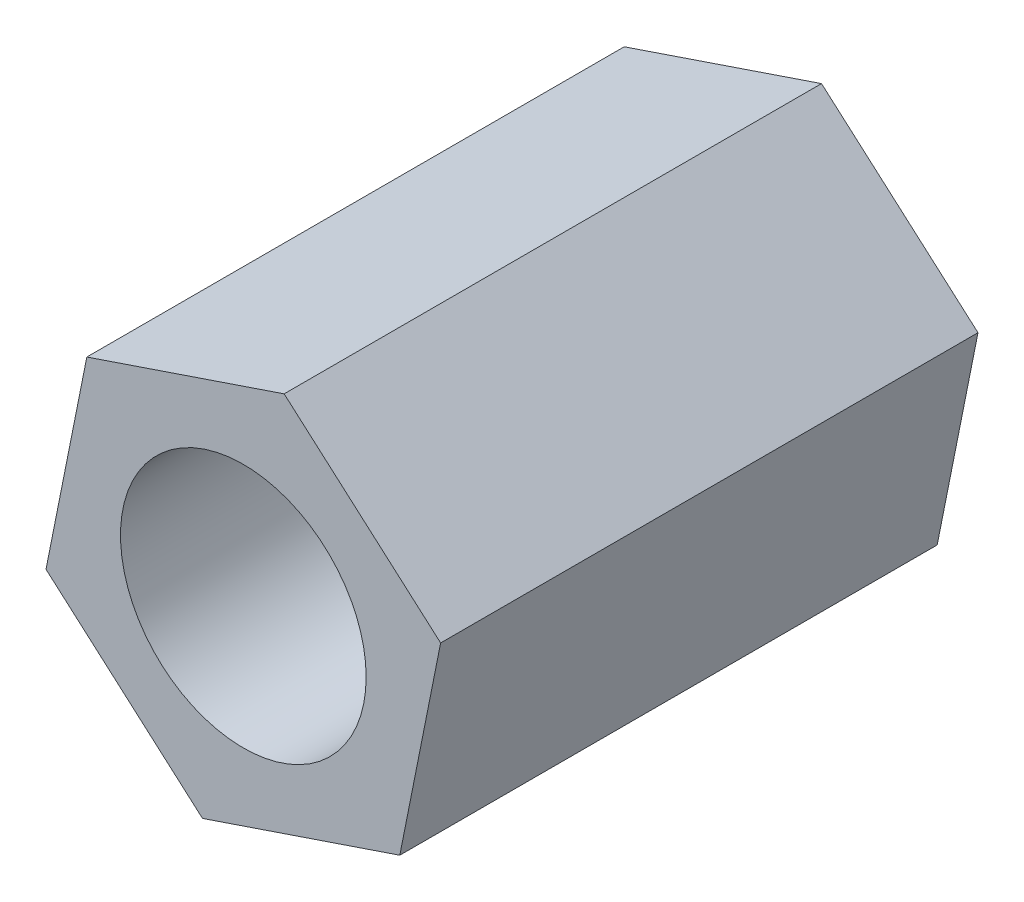
ISO-10303-21;
HEADER;
FILE_DESCRIPTION(('STEP AP214'),'2;1');
FILE_NAME('part.step','',(''),(''),'','','');
FILE_SCHEMA(('AUTOMOTIVE_DESIGN { 1 0 10303 214 1 1 1 1 }'));
ENDSEC;
DATA;
#1=APPLICATION_CONTEXT('core data for automotive mechanical design processes');
#2=APPLICATION_PROTOCOL_DEFINITION('international standard','automotive_design',2000,#1);
#3=PRODUCT_CONTEXT('',#1,'mechanical');
#4=PRODUCT('Part','Part','',(#3));
#5=PRODUCT_RELATED_PRODUCT_CATEGORY('part','',(#4));
#6=PRODUCT_DEFINITION_FORMATION('','',#4);
#7=PRODUCT_DEFINITION_CONTEXT('part definition',#1,'design');
#8=PRODUCT_DEFINITION('design','',#6,#7);
#9=PRODUCT_DEFINITION_SHAPE('','',#8);
#10=(LENGTH_UNIT() NAMED_UNIT(*) SI_UNIT(.MILLI.,.METRE.));
#11=(NAMED_UNIT(*) PLANE_ANGLE_UNIT() SI_UNIT($,.RADIAN.));
#12=(NAMED_UNIT(*) SI_UNIT($,.STERADIAN.) SOLID_ANGLE_UNIT());
#13=UNCERTAINTY_MEASURE_WITH_UNIT(LENGTH_MEASURE(1.E-05),#10,'distance_accuracy_value','');
#14=(GEOMETRIC_REPRESENTATION_CONTEXT(3) GLOBAL_UNCERTAINTY_ASSIGNED_CONTEXT((#13)) GLOBAL_UNIT_ASSIGNED_CONTEXT((#10,
#11,#12)) REPRESENTATION_CONTEXT('',''));
#15=CARTESIAN_POINT('',(0.,0.,0.));
#16=DIRECTION('',(0.,0.,1.));
#17=DIRECTION('',(1.,0.,0.));
#18=AXIS2_PLACEMENT_3D('',#15,#16,#17);
#19=CARTESIAN_POINT('',(0.,0.,7.));
#20=DIRECTION('',(0.,0.,1.));
#21=DIRECTION('',(1.,0.,0.));
#22=AXIS2_PLACEMENT_3D('',#19,#20,#21);
#23=PLANE('',#22);
#24=DIRECTION('',(0.947235538078911,0.320538352464033,0.));
#25=VECTOR('',#24,1.);
#26=CARTESIAN_POINT('',(-0.531918600014743,-2.6609013390751,7.));
#27=LINE('',#26,#25);
#28=CARTESIAN_POINT('',(-0.531918600014743,-2.6609013390751,7.));
#29=VERTEX_POINT('',#28);
#30=CARTESIAN_POINT('',(2.0384488565957,-1.79110568989578,7.));
#31=VERTEX_POINT('',#30);
#32=EDGE_CURVE('E152',#29,#31,#27,.T.);
#33=ORIENTED_EDGE('',*,*,#32,.T.);
#34=DIRECTION('',(0.196023412918392,0.980599215575775,0.));
#35=VECTOR('',#34,1.);
#36=CARTESIAN_POINT('',(2.0384488565957,-1.79110568989578,7.));
#37=LINE('',#36,#35);
#38=CARTESIAN_POINT('',(2.57036745661044,0.869795649179331,7.));
#39=VERTEX_POINT('',#38);
#40=EDGE_CURVE('E100',#31,#39,#37,.T.);
#41=ORIENTED_EDGE('',*,*,#40,.T.);
#42=DIRECTION('',(-0.751212125160518,0.660060863111742,0.));
#43=VECTOR('',#42,1.);
#44=CARTESIAN_POINT('',(2.57036745661044,0.869795649179331,7.));
#45=LINE('',#44,#43);
#46=CARTESIAN_POINT('',(0.531918600014744,2.66090133907511,7.));
#47=VERTEX_POINT('',#46);
#48=EDGE_CURVE('E113',#39,#47,#45,.T.);
#49=ORIENTED_EDGE('',*,*,#48,.T.);
#50=DIRECTION('',(-0.947235538078911,-0.320538352464033,0.));
#51=VECTOR('',#50,1.);
#52=CARTESIAN_POINT('',(0.531918600014744,2.66090133907511,7.));
#53=LINE('',#52,#51);
#54=CARTESIAN_POINT('',(-2.0384488565957,1.79110568989578,7.));
#55=VERTEX_POINT('',#54);
#56=EDGE_CURVE('E107',#47,#55,#53,.T.);
#57=ORIENTED_EDGE('',*,*,#56,.T.);
#58=DIRECTION('',(-0.196023412918393,-0.980599215575775,0.));
#59=VECTOR('',#58,1.);
#60=CARTESIAN_POINT('',(-2.0384488565957,1.79110568989578,7.));
#61=LINE('',#60,#59);
#62=CARTESIAN_POINT('',(-2.57036745661044,-0.869795649179329,7.));
#63=VERTEX_POINT('',#62);
#64=EDGE_CURVE('E111',#55,#63,#61,.T.);
#65=ORIENTED_EDGE('',*,*,#64,.T.);
#66=DIRECTION('',(0.751212125160518,-0.660060863111742,0.));
#67=VECTOR('',#66,1.);
#68=CARTESIAN_POINT('',(-2.57036745661044,-0.869795649179329,7.));
#69=LINE('',#68,#67);
#70=EDGE_CURVE('E63',#63,#29,#69,.T.);
#71=ORIENTED_EDGE('',*,*,#70,.T.);
#72=EDGE_LOOP('',(#33,#41,#49,#57,#65,#71));
#73=FACE_BOUND('',#72,.T.);
#74=CARTESIAN_POINT('',(0.,0.,7.));
#75=DIRECTION('',(0.,0.,1.));
#76=DIRECTION('',(1.,0.,0.));
#77=AXIS2_PLACEMENT_3D('',#74,#75,#76);
#78=CIRCLE('',#77,1.6);
#79=CARTESIAN_POINT('',(1.6,0.,7.));
#80=VERTEX_POINT('',#79);
#81=EDGE_CURVE('E140',#80,#80,#78,.T.);
#82=ORIENTED_EDGE('',*,*,#81,.F.);
#83=EDGE_LOOP('',(#82));
#84=FACE_BOUND('',#83,.T.);
#85=ADVANCED_FACE('F45',(#73,#84),#23,.T.);
#86=CARTESIAN_POINT('',(0.,0.,0.));
#87=DIRECTION('',(0.,0.,1.));
#88=DIRECTION('',(1.,0.,0.));
#89=AXIS2_PLACEMENT_3D('',#86,#87,#88);
#90=PLANE('',#89);
#91=DIRECTION('',(0.947235538078911,0.320538352464033,0.));
#92=VECTOR('',#91,1.);
#93=CARTESIAN_POINT('',(-0.531918600014743,-2.6609013390751,0.));
#94=LINE('',#93,#92);
#95=CARTESIAN_POINT('',(-0.531918600014743,-2.6609013390751,0.));
#96=VERTEX_POINT('',#95);
#97=CARTESIAN_POINT('',(2.0384488565957,-1.79110568989578,0.));
#98=VERTEX_POINT('',#97);
#99=EDGE_CURVE('E135',#96,#98,#94,.T.);
#100=ORIENTED_EDGE('',*,*,#99,.F.);
#101=DIRECTION('',(0.751212125160518,-0.660060863111742,0.));
#102=VECTOR('',#101,1.);
#103=CARTESIAN_POINT('',(-2.57036745661044,-0.869795649179329,0.));
#104=LINE('',#103,#102);
#105=CARTESIAN_POINT('',(-2.57036745661044,-0.869795649179329,0.));
#106=VERTEX_POINT('',#105);
#107=EDGE_CURVE('E92',#106,#96,#104,.T.);
#108=ORIENTED_EDGE('',*,*,#107,.F.);
#109=DIRECTION('',(-0.196023412918393,-0.980599215575775,0.));
#110=VECTOR('',#109,1.);
#111=CARTESIAN_POINT('',(-2.0384488565957,1.79110568989578,0.));
#112=LINE('',#111,#110);
#113=CARTESIAN_POINT('',(-2.0384488565957,1.79110568989578,0.));
#114=VERTEX_POINT('',#113);
#115=EDGE_CURVE('E86',#114,#106,#112,.T.);
#116=ORIENTED_EDGE('',*,*,#115,.F.);
#117=DIRECTION('',(-0.947235538078911,-0.320538352464033,0.));
#118=VECTOR('',#117,1.);
#119=CARTESIAN_POINT('',(0.531918600014744,2.66090133907511,0.));
#120=LINE('',#119,#118);
#121=CARTESIAN_POINT('',(0.531918600014744,2.66090133907511,0.));
#122=VERTEX_POINT('',#121);
#123=EDGE_CURVE('E122',#122,#114,#120,.T.);
#124=ORIENTED_EDGE('',*,*,#123,.F.);
#125=DIRECTION('',(-0.751212125160518,0.660060863111742,0.));
#126=VECTOR('',#125,1.);
#127=CARTESIAN_POINT('',(2.57036745661044,0.869795649179331,0.));
#128=LINE('',#127,#126);
#129=CARTESIAN_POINT('',(2.57036745661044,0.869795649179331,0.));
#130=VERTEX_POINT('',#129);
#131=EDGE_CURVE('E143',#130,#122,#128,.T.);
#132=ORIENTED_EDGE('',*,*,#131,.F.);
#133=DIRECTION('',(0.196023412918392,0.980599215575775,0.));
#134=VECTOR('',#133,1.);
#135=CARTESIAN_POINT('',(2.0384488565957,-1.79110568989578,0.));
#136=LINE('',#135,#134);
#137=EDGE_CURVE('E139',#98,#130,#136,.T.);
#138=ORIENTED_EDGE('',*,*,#137,.F.);
#139=EDGE_LOOP('',(#100,#108,#116,#124,#132,#138));
#140=FACE_BOUND('',#139,.T.);
#141=CARTESIAN_POINT('',(0.,0.,0.));
#142=DIRECTION('',(0.,0.,1.));
#143=DIRECTION('',(1.,0.,0.));
#144=AXIS2_PLACEMENT_3D('',#141,#142,#143);
#145=CIRCLE('',#144,1.6);
#146=CARTESIAN_POINT('',(1.6,0.,0.));
#147=VERTEX_POINT('',#146);
#148=EDGE_CURVE('E249',#147,#147,#145,.T.);
#149=ORIENTED_EDGE('',*,*,#148,.T.);
#150=EDGE_LOOP('',(#149));
#151=FACE_BOUND('',#150,.T.);
#152=ADVANCED_FACE('F165',(#140,#151),#90,.F.);
#153=CARTESIAN_POINT('',(-0.531918600014743,-2.6609013390751,7.));
#154=DIRECTION('',(-0.320538352464033,0.947235538078911,0.));
#155=DIRECTION('',(-0.947235538078911,-0.320538352464033,0.));
#156=AXIS2_PLACEMENT_3D('',#153,#154,#155);
#157=PLANE('',#156);
#158=ORIENTED_EDGE('',*,*,#99,.T.);
#159=DIRECTION('',(0.,0.,-1.));
#160=VECTOR('',#159,1.);
#161=CARTESIAN_POINT('',(2.0384488565957,-1.79110568989578,7.));
#162=LINE('',#161,#160);
#163=EDGE_CURVE('E11',#31,#98,#162,.T.);
#164=ORIENTED_EDGE('',*,*,#163,.F.);
#165=ORIENTED_EDGE('',*,*,#32,.F.);
#166=DIRECTION('',(0.,0.,-1.));
#167=VECTOR('',#166,1.);
#168=CARTESIAN_POINT('',(-0.531918600014743,-2.6609013390751,7.));
#169=LINE('',#168,#167);
#170=EDGE_CURVE('E131',#29,#96,#169,.T.);
#171=ORIENTED_EDGE('',*,*,#170,.T.);
#172=EDGE_LOOP('',(#158,#164,#165,#171));
#173=FACE_BOUND('',#172,.T.);
#174=ADVANCED_FACE('F47',(#173),#157,.F.);
#175=CARTESIAN_POINT('',(2.0384488565957,-1.79110568989578,7.));
#176=DIRECTION('',(-0.980599215575775,0.196023412918392,0.));
#177=DIRECTION('',(-0.196023412918392,-0.980599215575775,0.));
#178=AXIS2_PLACEMENT_3D('',#175,#176,#177);
#179=PLANE('',#178);
#180=ORIENTED_EDGE('',*,*,#137,.T.);
#181=DIRECTION('',(0.,0.,-1.));
#182=VECTOR('',#181,1.);
#183=CARTESIAN_POINT('',(2.57036745661044,0.869795649179331,7.));
#184=LINE('',#183,#182);
#185=EDGE_CURVE('E55',#39,#130,#184,.T.);
#186=ORIENTED_EDGE('',*,*,#185,.F.);
#187=ORIENTED_EDGE('',*,*,#40,.F.);
#188=ORIENTED_EDGE('',*,*,#163,.T.);
#189=EDGE_LOOP('',(#180,#186,#187,#188));
#190=FACE_BOUND('',#189,.T.);
#191=ADVANCED_FACE('F190',(#190),#179,.F.);
#192=CARTESIAN_POINT('',(2.57036745661044,0.869795649179331,7.));
#193=DIRECTION('',(-0.660060863111742,-0.751212125160518,0.));
#194=DIRECTION('',(0.751212125160518,-0.660060863111742,0.));
#195=AXIS2_PLACEMENT_3D('',#192,#193,#194);
#196=PLANE('',#195);
#197=ORIENTED_EDGE('',*,*,#131,.T.);
#198=DIRECTION('',(0.,0.,-1.));
#199=VECTOR('',#198,1.);
#200=CARTESIAN_POINT('',(0.531918600014744,2.66090133907511,7.));
#201=LINE('',#200,#199);
#202=EDGE_CURVE('E124',#47,#122,#201,.T.);
#203=ORIENTED_EDGE('',*,*,#202,.F.);
#204=ORIENTED_EDGE('',*,*,#48,.F.);
#205=ORIENTED_EDGE('',*,*,#185,.T.);
#206=EDGE_LOOP('',(#197,#203,#204,#205));
#207=FACE_BOUND('',#206,.T.);
#208=ADVANCED_FACE('F162',(#207),#196,.F.);
#209=CARTESIAN_POINT('',(0.531918600014744,2.66090133907511,7.));
#210=DIRECTION('',(0.320538352464033,-0.947235538078911,0.));
#211=DIRECTION('',(0.947235538078911,0.320538352464033,0.));
#212=AXIS2_PLACEMENT_3D('',#209,#210,#211);
#213=PLANE('',#212);
#214=ORIENTED_EDGE('',*,*,#123,.T.);
#215=DIRECTION('',(0.,0.,-1.));
#216=VECTOR('',#215,1.);
#217=CARTESIAN_POINT('',(-2.0384488565957,1.79110568989578,7.));
#218=LINE('',#217,#216);
#219=EDGE_CURVE('E119',#55,#114,#218,.T.);
#220=ORIENTED_EDGE('',*,*,#219,.F.);
#221=ORIENTED_EDGE('',*,*,#56,.F.);
#222=ORIENTED_EDGE('',*,*,#202,.T.);
#223=EDGE_LOOP('',(#214,#220,#221,#222));
#224=FACE_BOUND('',#223,.T.);
#225=ADVANCED_FACE('F120',(#224),#213,.F.);
#226=CARTESIAN_POINT('',(-2.0384488565957,1.79110568989578,7.));
#227=DIRECTION('',(0.980599215575775,-0.196023412918392,0.));
#228=DIRECTION('',(0.196023412918393,0.980599215575775,0.));
#229=AXIS2_PLACEMENT_3D('',#226,#227,#228);
#230=PLANE('',#229);
#231=ORIENTED_EDGE('',*,*,#115,.T.);
#232=DIRECTION('',(0.,0.,-1.));
#233=VECTOR('',#232,1.);
#234=CARTESIAN_POINT('',(-2.57036745661044,-0.869795649179329,7.));
#235=LINE('',#234,#233);
#236=EDGE_CURVE('E125',#63,#106,#235,.T.);
#237=ORIENTED_EDGE('',*,*,#236,.F.);
#238=ORIENTED_EDGE('',*,*,#64,.F.);
#239=ORIENTED_EDGE('',*,*,#219,.T.);
#240=EDGE_LOOP('',(#231,#237,#238,#239));
#241=FACE_BOUND('',#240,.T.);
#242=ADVANCED_FACE('F127',(#241),#230,.F.);
#243=CARTESIAN_POINT('',(-2.57036745661044,-0.869795649179329,7.));
#244=DIRECTION('',(0.660060863111742,0.751212125160518,0.));
#245=DIRECTION('',(-0.751212125160518,0.660060863111742,0.));
#246=AXIS2_PLACEMENT_3D('',#243,#244,#245);
#247=PLANE('',#246);
#248=ORIENTED_EDGE('',*,*,#107,.T.);
#249=ORIENTED_EDGE('',*,*,#170,.F.);
#250=ORIENTED_EDGE('',*,*,#70,.F.);
#251=ORIENTED_EDGE('',*,*,#236,.T.);
#252=EDGE_LOOP('',(#248,#249,#250,#251));
#253=FACE_BOUND('',#252,.T.);
#254=ADVANCED_FACE('F170',(#253),#247,.F.);
#255=CARTESIAN_POINT('',(0.,0.,7.));
#256=DIRECTION('',(0.,0.,-1.));
#257=DIRECTION('',(-1.,0.,0.));
#258=AXIS2_PLACEMENT_3D('',#255,#256,#257);
#259=CYLINDRICAL_SURFACE('',#258,1.6);
#260=ORIENTED_EDGE('',*,*,#81,.T.);
#261=EDGE_LOOP('',(#260));
#262=FACE_BOUND('',#261,.T.);
#263=ORIENTED_EDGE('',*,*,#148,.F.);
#264=EDGE_LOOP('',(#263));
#265=FACE_BOUND('',#264,.T.);
#266=ADVANCED_FACE('F172',(#262,#265),#259,.F.);
#267=CLOSED_SHELL('',(#85,#152,#174,#191,#208,#225,#242,#254,#266));
#268=MANIFOLD_SOLID_BREP('B2',#267);
#269=ADVANCED_BREP_SHAPE_REPRESENTATION('',(#18,#268),#14);
#270=SHAPE_DEFINITION_REPRESENTATION(#9,#269);
ENDSEC;
END-ISO-10303-21;
